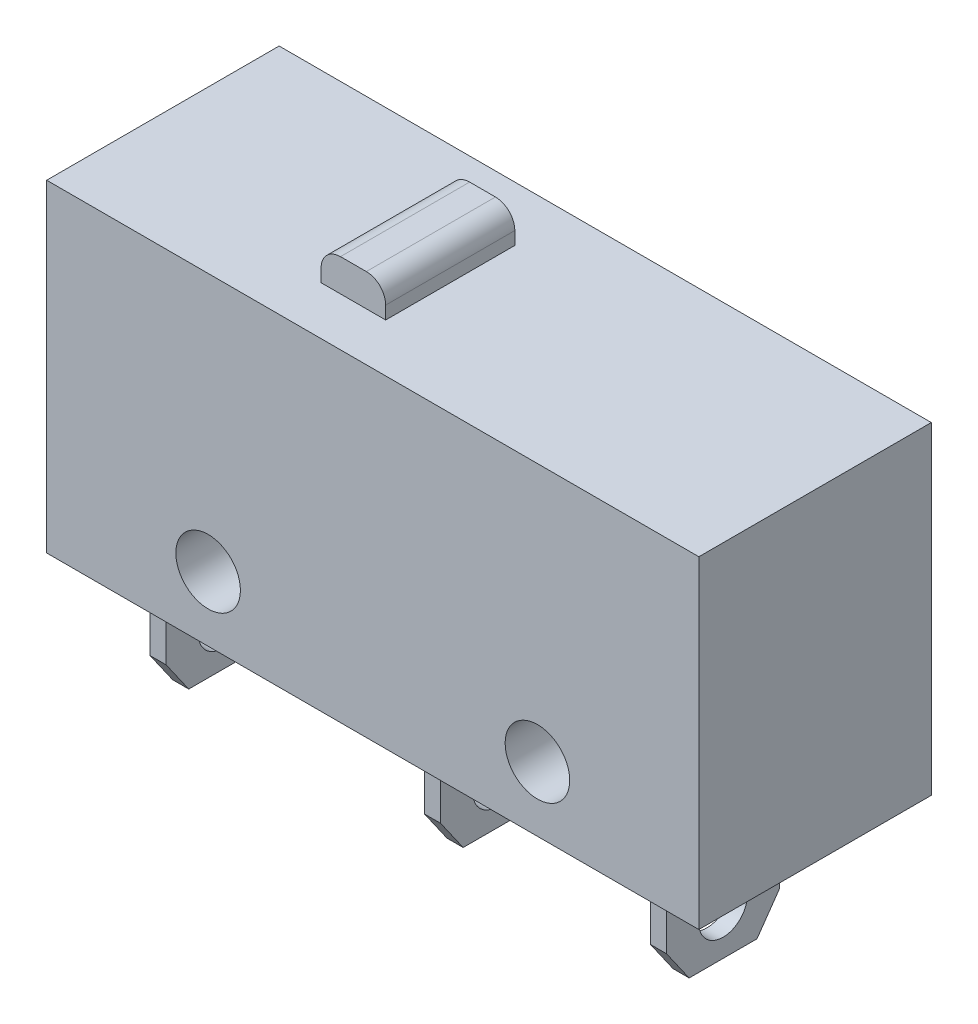
ISO-10303-21;
HEADER;
FILE_DESCRIPTION(('STEP AP214'),'2;1');
FILE_NAME('part.step','',(''),(''),'','','');
FILE_SCHEMA(('AUTOMOTIVE_DESIGN { 1 0 10303 214 1 1 1 1 }'));
ENDSEC;
DATA;
#1=APPLICATION_CONTEXT('core data for automotive mechanical design processes');
#2=APPLICATION_PROTOCOL_DEFINITION('international standard','automotive_design',2000,#1);
#3=PRODUCT_CONTEXT('',#1,'mechanical');
#4=PRODUCT('Part','Part','',(#3));
#5=PRODUCT_RELATED_PRODUCT_CATEGORY('part','',(#4));
#6=PRODUCT_DEFINITION_FORMATION('','',#4);
#7=PRODUCT_DEFINITION_CONTEXT('part definition',#1,'design');
#8=PRODUCT_DEFINITION('design','',#6,#7);
#9=PRODUCT_DEFINITION_SHAPE('','',#8);
#10=(LENGTH_UNIT() NAMED_UNIT(*) SI_UNIT(.MILLI.,.METRE.));
#11=(NAMED_UNIT(*) PLANE_ANGLE_UNIT() SI_UNIT($,.RADIAN.));
#12=(NAMED_UNIT(*) SI_UNIT($,.STERADIAN.) SOLID_ANGLE_UNIT());
#13=UNCERTAINTY_MEASURE_WITH_UNIT(LENGTH_MEASURE(1.E-05),#10,'distance_accuracy_value','');
#14=(GEOMETRIC_REPRESENTATION_CONTEXT(3) GLOBAL_UNCERTAINTY_ASSIGNED_CONTEXT((#13)) GLOBAL_UNIT_ASSIGNED_CONTEXT((#10,
#11,#12)) REPRESENTATION_CONTEXT('',''));
#15=CARTESIAN_POINT('',(0.,0.,0.));
#16=DIRECTION('',(0.,0.,1.));
#17=DIRECTION('',(1.,0.,0.));
#18=AXIS2_PLACEMENT_3D('',#15,#16,#17);
#19=CARTESIAN_POINT('',(0.,10.,0.));
#20=DIRECTION('',(0.,1.,0.));
#21=DIRECTION('',(0.,0.,1.));
#22=AXIS2_PLACEMENT_3D('',#19,#20,#21);
#23=PLANE('',#22);
#24=DIRECTION('',(0.,0.,-1.));
#25=VECTOR('',#24,1.);
#26=CARTESIAN_POINT('',(10.1,10.,-3.6));
#27=LINE('',#26,#25);
#28=CARTESIAN_POINT('',(10.1,10.,3.6));
#29=VERTEX_POINT('',#28);
#30=CARTESIAN_POINT('',(10.1,10.,-3.6));
#31=VERTEX_POINT('',#30);
#32=EDGE_CURVE('E374',#29,#31,#27,.T.);
#33=ORIENTED_EDGE('',*,*,#32,.T.);
#34=DIRECTION('',(-1.,0.,0.));
#35=VECTOR('',#34,1.);
#36=CARTESIAN_POINT('',(-10.1,10.,-3.6));
#37=LINE('',#36,#35);
#38=CARTESIAN_POINT('',(-10.1,10.,-3.6));
#39=VERTEX_POINT('',#38);
#40=EDGE_CURVE('E377',#31,#39,#37,.T.);
#41=ORIENTED_EDGE('',*,*,#40,.T.);
#42=DIRECTION('',(0.,0.,1.));
#43=VECTOR('',#42,1.);
#44=CARTESIAN_POINT('',(-10.1,10.,-3.6));
#45=LINE('',#44,#43);
#46=CARTESIAN_POINT('',(-10.1,10.,3.6));
#47=VERTEX_POINT('',#46);
#48=EDGE_CURVE('E380',#39,#47,#45,.T.);
#49=ORIENTED_EDGE('',*,*,#48,.T.);
#50=DIRECTION('',(1.,0.,0.));
#51=VECTOR('',#50,1.);
#52=CARTESIAN_POINT('',(-10.1,10.,3.6));
#53=LINE('',#52,#51);
#54=EDGE_CURVE('E382',#47,#29,#53,.T.);
#55=ORIENTED_EDGE('',*,*,#54,.T.);
#56=EDGE_LOOP('',(#33,#41,#49,#55));
#57=FACE_BOUND('',#56,.T.);
#58=DIRECTION('',(1.,0.,0.));
#59=VECTOR('',#58,1.);
#60=CARTESIAN_POINT('',(-3.1,10.,2.1));
#61=LINE('',#60,#59);
#62=CARTESIAN_POINT('',(-3.1,10.,2.1));
#63=VERTEX_POINT('',#62);
#64=CARTESIAN_POINT('',(-1.1,10.,2.1));
#65=VERTEX_POINT('',#64);
#66=EDGE_CURVE('E236',#63,#65,#61,.T.);
#67=ORIENTED_EDGE('',*,*,#66,.F.);
#68=DIRECTION('',(0.,0.,1.));
#69=VECTOR('',#68,1.);
#70=CARTESIAN_POINT('',(-3.1,10.,2.1));
#71=LINE('',#70,#69);
#72=CARTESIAN_POINT('',(-3.1,10.,-1.9));
#73=VERTEX_POINT('',#72);
#74=EDGE_CURVE('E244',#73,#63,#71,.T.);
#75=ORIENTED_EDGE('',*,*,#74,.F.);
#76=DIRECTION('',(-1.,0.,0.));
#77=VECTOR('',#76,1.);
#78=CARTESIAN_POINT('',(-3.1,10.,-1.9));
#79=LINE('',#78,#77);
#80=CARTESIAN_POINT('',(-1.1,10.,-1.9));
#81=VERTEX_POINT('',#80);
#82=EDGE_CURVE('E255',#81,#73,#79,.T.);
#83=ORIENTED_EDGE('',*,*,#82,.F.);
#84=DIRECTION('',(0.,0.,-1.));
#85=VECTOR('',#84,1.);
#86=CARTESIAN_POINT('',(-1.1,10.,2.1));
#87=LINE('',#86,#85);
#88=EDGE_CURVE('E253',#65,#81,#87,.T.);
#89=ORIENTED_EDGE('',*,*,#88,.F.);
#90=EDGE_LOOP('',(#67,#75,#83,#89));
#91=FACE_BOUND('',#90,.T.);
#92=ADVANCED_FACE('F49',(#57,#91),#23,.T.);
#93=CARTESIAN_POINT('',(0.,0.,0.));
#94=DIRECTION('',(0.,1.,0.));
#95=DIRECTION('',(0.,0.,1.));
#96=AXIS2_PLACEMENT_3D('',#93,#94,#95);
#97=PLANE('',#96);
#98=DIRECTION('',(1.,0.,0.));
#99=VECTOR('',#98,1.);
#100=CARTESIAN_POINT('',(6.75,0.,-1.75));
#101=LINE('',#100,#99);
#102=CARTESIAN_POINT('',(6.75,0.,-1.75));
#103=VERTEX_POINT('',#102);
#104=CARTESIAN_POINT('',(7.25,0.,-1.75));
#105=VERTEX_POINT('',#104);
#106=EDGE_CURVE('E321',#103,#105,#101,.T.);
#107=ORIENTED_EDGE('',*,*,#106,.F.);
#108=DIRECTION('',(0.,0.,-1.));
#109=VECTOR('',#108,1.);
#110=CARTESIAN_POINT('',(6.75,0.,1.75));
#111=LINE('',#110,#109);
#112=CARTESIAN_POINT('',(6.75,0.,1.75));
#113=VERTEX_POINT('',#112);
#114=EDGE_CURVE('E326',#113,#103,#111,.T.);
#115=ORIENTED_EDGE('',*,*,#114,.F.);
#116=DIRECTION('',(-1.,0.,0.));
#117=VECTOR('',#116,1.);
#118=CARTESIAN_POINT('',(6.75,0.,1.75));
#119=LINE('',#118,#117);
#120=CARTESIAN_POINT('',(7.25,0.,1.75));
#121=VERTEX_POINT('',#120);
#122=EDGE_CURVE('E335',#121,#113,#119,.T.);
#123=ORIENTED_EDGE('',*,*,#122,.F.);
#124=DIRECTION('',(0.,0.,1.));
#125=VECTOR('',#124,1.);
#126=CARTESIAN_POINT('',(7.25,0.,1.75));
#127=LINE('',#126,#125);
#128=EDGE_CURVE('E332',#105,#121,#127,.T.);
#129=ORIENTED_EDGE('',*,*,#128,.F.);
#130=EDGE_LOOP('',(#107,#115,#123,#129));
#131=FACE_BOUND('',#130,.T.);
#132=DIRECTION('',(0.,0.,-1.));
#133=VECTOR('',#132,1.);
#134=CARTESIAN_POINT('',(10.1,0.,-3.6));
#135=LINE('',#134,#133);
#136=CARTESIAN_POINT('',(10.1,0.,3.6));
#137=VERTEX_POINT('',#136);
#138=CARTESIAN_POINT('',(10.1,0.,-3.6));
#139=VERTEX_POINT('',#138);
#140=EDGE_CURVE('E373',#137,#139,#135,.T.);
#141=ORIENTED_EDGE('',*,*,#140,.F.);
#142=DIRECTION('',(1.,0.,0.));
#143=VECTOR('',#142,1.);
#144=CARTESIAN_POINT('',(-10.1,0.,3.6));
#145=LINE('',#144,#143);
#146=CARTESIAN_POINT('',(-10.1,0.,3.6));
#147=VERTEX_POINT('',#146);
#148=EDGE_CURVE('E378',#147,#137,#145,.T.);
#149=ORIENTED_EDGE('',*,*,#148,.F.);
#150=DIRECTION('',(0.,0.,1.));
#151=VECTOR('',#150,1.);
#152=CARTESIAN_POINT('',(-10.1,0.,-3.6));
#153=LINE('',#152,#151);
#154=CARTESIAN_POINT('',(-10.1,0.,-3.6));
#155=VERTEX_POINT('',#154);
#156=EDGE_CURVE('E389',#155,#147,#153,.T.);
#157=ORIENTED_EDGE('',*,*,#156,.F.);
#158=DIRECTION('',(-1.,0.,0.));
#159=VECTOR('',#158,1.);
#160=CARTESIAN_POINT('',(-10.1,0.,-3.6));
#161=LINE('',#160,#159);
#162=EDGE_CURVE('E387',#139,#155,#161,.T.);
#163=ORIENTED_EDGE('',*,*,#162,.F.);
#164=EDGE_LOOP('',(#141,#149,#157,#163));
#165=FACE_BOUND('',#164,.T.);
#166=DIRECTION('',(0.,0.,1.));
#167=VECTOR('',#166,1.);
#168=CARTESIAN_POINT('',(0.25,0.,1.75));
#169=LINE('',#168,#167);
#170=CARTESIAN_POINT('',(0.25,0.,-1.75));
#171=VERTEX_POINT('',#170);
#172=CARTESIAN_POINT('',(0.25,0.,1.75));
#173=VERTEX_POINT('',#172);
#174=EDGE_CURVE('E347',#171,#173,#169,.T.);
#175=ORIENTED_EDGE('',*,*,#174,.F.);
#176=DIRECTION('',(1.,0.,0.));
#177=VECTOR('',#176,1.);
#178=CARTESIAN_POINT('',(-0.25,0.,-1.75));
#179=LINE('',#178,#177);
#180=CARTESIAN_POINT('',(-0.25,0.,-1.75));
#181=VERTEX_POINT('',#180);
#182=EDGE_CURVE('E352',#181,#171,#179,.T.);
#183=ORIENTED_EDGE('',*,*,#182,.F.);
#184=DIRECTION('',(0.,0.,-1.));
#185=VECTOR('',#184,1.);
#186=CARTESIAN_POINT('',(-0.25,0.,1.75));
#187=LINE('',#186,#185);
#188=CARTESIAN_POINT('',(-0.25,0.,1.75));
#189=VERTEX_POINT('',#188);
#190=EDGE_CURVE('E361',#189,#181,#187,.T.);
#191=ORIENTED_EDGE('',*,*,#190,.F.);
#192=DIRECTION('',(-1.,0.,0.));
#193=VECTOR('',#192,1.);
#194=CARTESIAN_POINT('',(-0.25,0.,1.75));
#195=LINE('',#194,#193);
#196=EDGE_CURVE('E358',#173,#189,#195,.T.);
#197=ORIENTED_EDGE('',*,*,#196,.F.);
#198=EDGE_LOOP('',(#175,#183,#191,#197));
#199=FACE_BOUND('',#198,.T.);
#200=DIRECTION('',(1.,0.,0.));
#201=VECTOR('',#200,1.);
#202=CARTESIAN_POINT('',(-8.75,0.,-1.75));
#203=LINE('',#202,#201);
#204=CARTESIAN_POINT('',(-8.75,0.,-1.75));
#205=VERTEX_POINT('',#204);
#206=CARTESIAN_POINT('',(-8.25,0.,-1.75));
#207=VERTEX_POINT('',#206);
#208=EDGE_CURVE('E295',#205,#207,#203,.T.);
#209=ORIENTED_EDGE('',*,*,#208,.F.);
#210=DIRECTION('',(0.,0.,-1.));
#211=VECTOR('',#210,1.);
#212=CARTESIAN_POINT('',(-8.75,0.,1.75));
#213=LINE('',#212,#211);
#214=CARTESIAN_POINT('',(-8.75,0.,1.75));
#215=VERTEX_POINT('',#214);
#216=EDGE_CURVE('E300',#215,#205,#213,.T.);
#217=ORIENTED_EDGE('',*,*,#216,.F.);
#218=DIRECTION('',(-1.,0.,0.));
#219=VECTOR('',#218,1.);
#220=CARTESIAN_POINT('',(-8.75,0.,1.75));
#221=LINE('',#220,#219);
#222=CARTESIAN_POINT('',(-8.25,0.,1.75));
#223=VERTEX_POINT('',#222);
#224=EDGE_CURVE('E309',#223,#215,#221,.T.);
#225=ORIENTED_EDGE('',*,*,#224,.F.);
#226=DIRECTION('',(0.,0.,1.));
#227=VECTOR('',#226,1.);
#228=CARTESIAN_POINT('',(-8.25,0.,1.75));
#229=LINE('',#228,#227);
#230=EDGE_CURVE('E306',#207,#223,#229,.T.);
#231=ORIENTED_EDGE('',*,*,#230,.F.);
#232=EDGE_LOOP('',(#209,#217,#225,#231));
#233=FACE_BOUND('',#232,.T.);
#234=ADVANCED_FACE('F489',(#131,#165,#199,#233),#97,.F.);
#235=CARTESIAN_POINT('',(10.1,10.,-3.6));
#236=DIRECTION('',(-1.,0.,0.));
#237=DIRECTION('',(0.,0.,1.));
#238=AXIS2_PLACEMENT_3D('',#235,#236,#237);
#239=PLANE('',#238);
#240=ORIENTED_EDGE('',*,*,#140,.T.);
#241=DIRECTION('',(0.,-1.,0.));
#242=VECTOR('',#241,1.);
#243=CARTESIAN_POINT('',(10.1,10.,-3.6));
#244=LINE('',#243,#242);
#245=EDGE_CURVE('E400',#31,#139,#244,.T.);
#246=ORIENTED_EDGE('',*,*,#245,.F.);
#247=ORIENTED_EDGE('',*,*,#32,.F.);
#248=DIRECTION('',(0.,-1.,0.));
#249=VECTOR('',#248,1.);
#250=CARTESIAN_POINT('',(10.1,10.,3.6));
#251=LINE('',#250,#249);
#252=EDGE_CURVE('E384',#29,#137,#251,.T.);
#253=ORIENTED_EDGE('',*,*,#252,.T.);
#254=EDGE_LOOP('',(#240,#246,#247,#253));
#255=FACE_BOUND('',#254,.T.);
#256=ADVANCED_FACE('F495',(#255),#239,.F.);
#257=CARTESIAN_POINT('',(-10.1,10.,-3.6));
#258=DIRECTION('',(0.,0.,1.));
#259=DIRECTION('',(1.,0.,0.));
#260=AXIS2_PLACEMENT_3D('',#257,#258,#259);
#261=PLANE('',#260);
#262=CARTESIAN_POINT('',(-5.1,2.,-3.6));
#263=DIRECTION('',(0.,0.,-1.));
#264=DIRECTION('',(1.,0.,0.));
#265=AXIS2_PLACEMENT_3D('',#262,#263,#264);
#266=CIRCLE('',#265,1.);
#267=CARTESIAN_POINT('',(-4.1,2.,-3.6));
#268=VERTEX_POINT('',#267);
#269=EDGE_CURVE('E240',#268,#268,#266,.T.);
#270=ORIENTED_EDGE('',*,*,#269,.F.);
#271=EDGE_LOOP('',(#270));
#272=FACE_BOUND('',#271,.T.);
#273=CARTESIAN_POINT('',(5.1,2.,-3.6));
#274=DIRECTION('',(0.,0.,-1.));
#275=DIRECTION('',(-1.,0.,0.));
#276=AXIS2_PLACEMENT_3D('',#273,#274,#275);
#277=CIRCLE('',#276,1.);
#278=CARTESIAN_POINT('',(4.1,2.,-3.6));
#279=VERTEX_POINT('',#278);
#280=EDGE_CURVE('E269',#279,#279,#277,.T.);
#281=ORIENTED_EDGE('',*,*,#280,.F.);
#282=EDGE_LOOP('',(#281));
#283=FACE_BOUND('',#282,.T.);
#284=ORIENTED_EDGE('',*,*,#162,.T.);
#285=DIRECTION('',(0.,-1.,0.));
#286=VECTOR('',#285,1.);
#287=CARTESIAN_POINT('',(-10.1,10.,-3.6));
#288=LINE('',#287,#286);
#289=EDGE_CURVE('E397',#39,#155,#288,.T.);
#290=ORIENTED_EDGE('',*,*,#289,.F.);
#291=ORIENTED_EDGE('',*,*,#40,.F.);
#292=ORIENTED_EDGE('',*,*,#245,.T.);
#293=EDGE_LOOP('',(#284,#290,#291,#292));
#294=FACE_BOUND('',#293,.T.);
#295=ADVANCED_FACE('F509',(#272,#283,#294),#261,.F.);
#296=CARTESIAN_POINT('',(-10.1,10.,-3.6));
#297=DIRECTION('',(1.,0.,0.));
#298=DIRECTION('',(0.,0.,-1.));
#299=AXIS2_PLACEMENT_3D('',#296,#297,#298);
#300=PLANE('',#299);
#301=ORIENTED_EDGE('',*,*,#156,.T.);
#302=DIRECTION('',(0.,-1.,0.));
#303=VECTOR('',#302,1.);
#304=CARTESIAN_POINT('',(-10.1,10.,3.6));
#305=LINE('',#304,#303);
#306=EDGE_CURVE('E394',#47,#147,#305,.T.);
#307=ORIENTED_EDGE('',*,*,#306,.F.);
#308=ORIENTED_EDGE('',*,*,#48,.F.);
#309=ORIENTED_EDGE('',*,*,#289,.T.);
#310=EDGE_LOOP('',(#301,#307,#308,#309));
#311=FACE_BOUND('',#310,.T.);
#312=ADVANCED_FACE('F505',(#311),#300,.F.);
#313=CARTESIAN_POINT('',(-10.1,10.,3.6));
#314=DIRECTION('',(0.,0.,-1.));
#315=DIRECTION('',(-1.,0.,0.));
#316=AXIS2_PLACEMENT_3D('',#313,#314,#315);
#317=PLANE('',#316);
#318=CARTESIAN_POINT('',(-5.1,2.,3.6));
#319=DIRECTION('',(0.,0.,-1.));
#320=DIRECTION('',(1.,0.,0.));
#321=AXIS2_PLACEMENT_3D('',#318,#319,#320);
#322=CIRCLE('',#321,1.);
#323=CARTESIAN_POINT('',(-4.1,2.,3.6));
#324=VERTEX_POINT('',#323);
#325=EDGE_CURVE('E266',#324,#324,#322,.T.);
#326=ORIENTED_EDGE('',*,*,#325,.T.);
#327=EDGE_LOOP('',(#326));
#328=FACE_BOUND('',#327,.T.);
#329=CARTESIAN_POINT('',(5.1,2.,3.6));
#330=DIRECTION('',(0.,0.,-1.));
#331=DIRECTION('',(-1.,0.,0.));
#332=AXIS2_PLACEMENT_3D('',#329,#330,#331);
#333=CIRCLE('',#332,1.);
#334=CARTESIAN_POINT('',(4.1,2.,3.6));
#335=VERTEX_POINT('',#334);
#336=EDGE_CURVE('E272',#335,#335,#333,.T.);
#337=ORIENTED_EDGE('',*,*,#336,.T.);
#338=EDGE_LOOP('',(#337));
#339=FACE_BOUND('',#338,.T.);
#340=ORIENTED_EDGE('',*,*,#148,.T.);
#341=ORIENTED_EDGE('',*,*,#252,.F.);
#342=ORIENTED_EDGE('',*,*,#54,.F.);
#343=ORIENTED_EDGE('',*,*,#306,.T.);
#344=EDGE_LOOP('',(#340,#341,#342,#343));
#345=FACE_BOUND('',#344,.T.);
#346=ADVANCED_FACE('F502',(#328,#339,#345),#317,.F.);
#347=CARTESIAN_POINT('',(0.25,-4.,1.75));
#348=DIRECTION('',(-1.,0.,0.));
#349=DIRECTION('',(0.,0.,1.));
#350=AXIS2_PLACEMENT_3D('',#347,#348,#349);
#351=PLANE('',#350);
#352=CARTESIAN_POINT('',(0.25,-2.68085686499114,0.));
#353=DIRECTION('',(-1.,0.,0.));
#354=DIRECTION('',(0.,0.,1.));
#355=AXIS2_PLACEMENT_3D('',#352,#353,#354);
#356=CIRCLE('',#355,0.75);
#357=CARTESIAN_POINT('',(0.25,-2.68085686499114,0.75));
#358=VERTEX_POINT('',#357);
#359=EDGE_CURVE('E292',#358,#358,#356,.T.);
#360=ORIENTED_EDGE('',*,*,#359,.T.);
#361=EDGE_LOOP('',(#360));
#362=FACE_BOUND('',#361,.T.);
#363=DIRECTION('',(0.,1.,0.));
#364=VECTOR('',#363,1.);
#365=CARTESIAN_POINT('',(0.25,-4.,1.75));
#366=LINE('',#365,#364);
#367=CARTESIAN_POINT('',(0.25,-3.,1.75));
#368=VERTEX_POINT('',#367);
#369=EDGE_CURVE('E371',#368,#173,#366,.T.);
#370=ORIENTED_EDGE('',*,*,#369,.F.);
#371=DIRECTION('',(0.,-0.819152044288993,-0.573576436351045));
#372=VECTOR('',#371,1.);
#373=CARTESIAN_POINT('',(0.25,-4.,1.04979246179029));
#374=LINE('',#373,#372);
#375=CARTESIAN_POINT('',(0.25,-4.,1.04979246179029));
#376=VERTEX_POINT('',#375);
#377=EDGE_CURVE('E435',#368,#376,#374,.T.);
#378=ORIENTED_EDGE('',*,*,#377,.T.);
#379=DIRECTION('',(0.,0.,1.));
#380=VECTOR('',#379,1.);
#381=CARTESIAN_POINT('',(0.25,-4.,1.75));
#382=LINE('',#381,#380);
#383=CARTESIAN_POINT('',(0.25,-4.,-1.04979246179029));
#384=VERTEX_POINT('',#383);
#385=EDGE_CURVE('E348',#384,#376,#382,.T.);
#386=ORIENTED_EDGE('',*,*,#385,.F.);
#387=DIRECTION('',(0.,0.819152044288993,-0.573576436351045));
#388=VECTOR('',#387,1.);
#389=CARTESIAN_POINT('',(0.25,-4.,-1.04979246179029));
#390=LINE('',#389,#388);
#391=CARTESIAN_POINT('',(0.25,-3.,-1.75));
#392=VERTEX_POINT('',#391);
#393=EDGE_CURVE('E433',#384,#392,#390,.T.);
#394=ORIENTED_EDGE('',*,*,#393,.T.);
#395=DIRECTION('',(0.,1.,0.));
#396=VECTOR('',#395,1.);
#397=CARTESIAN_POINT('',(0.25,-4.,-1.75));
#398=LINE('',#397,#396);
#399=EDGE_CURVE('E355',#392,#171,#398,.T.);
#400=ORIENTED_EDGE('',*,*,#399,.T.);
#401=ORIENTED_EDGE('',*,*,#174,.T.);
#402=EDGE_LOOP('',(#370,#378,#386,#394,#400,#401));
#403=FACE_BOUND('',#402,.T.);
#404=ADVANCED_FACE('F499',(#362,#403),#351,.F.);
#405=CARTESIAN_POINT('',(-0.25,-4.,1.75));
#406=DIRECTION('',(0.,0.,-1.));
#407=DIRECTION('',(-1.,0.,0.));
#408=AXIS2_PLACEMENT_3D('',#405,#406,#407);
#409=PLANE('',#408);
#410=DIRECTION('',(0.,1.,0.));
#411=VECTOR('',#410,1.);
#412=CARTESIAN_POINT('',(-0.25,-4.,1.75));
#413=LINE('',#412,#411);
#414=CARTESIAN_POINT('',(-0.25,-3.,1.75));
#415=VERTEX_POINT('',#414);
#416=EDGE_CURVE('E369',#415,#189,#413,.T.);
#417=ORIENTED_EDGE('',*,*,#416,.F.);
#418=DIRECTION('',(1.,0.,0.));
#419=VECTOR('',#418,1.);
#420=CARTESIAN_POINT('',(0.25,-3.,1.75));
#421=LINE('',#420,#419);
#422=EDGE_CURVE('E431',#415,#368,#421,.T.);
#423=ORIENTED_EDGE('',*,*,#422,.T.);
#424=ORIENTED_EDGE('',*,*,#369,.T.);
#425=ORIENTED_EDGE('',*,*,#196,.T.);
#426=EDGE_LOOP('',(#417,#423,#424,#425));
#427=FACE_BOUND('',#426,.T.);
#428=ADVANCED_FACE('F619',(#427),#409,.F.);
#429=CARTESIAN_POINT('',(-0.25,-4.,1.75));
#430=DIRECTION('',(1.,0.,0.));
#431=DIRECTION('',(0.,0.,-1.));
#432=AXIS2_PLACEMENT_3D('',#429,#430,#431);
#433=PLANE('',#432);
#434=CARTESIAN_POINT('',(-0.25,-2.68085686499114,0.));
#435=DIRECTION('',(1.,0.,0.));
#436=DIRECTION('',(0.,0.,-1.));
#437=AXIS2_PLACEMENT_3D('',#434,#435,#436);
#438=CIRCLE('',#437,0.75);
#439=CARTESIAN_POINT('',(-0.25,-2.68085686499114,-0.75));
#440=VERTEX_POINT('',#439);
#441=EDGE_CURVE('E289',#440,#440,#438,.T.);
#442=ORIENTED_EDGE('',*,*,#441,.T.);
#443=EDGE_LOOP('',(#442));
#444=FACE_BOUND('',#443,.T.);
#445=DIRECTION('',(0.,0.,-1.));
#446=VECTOR('',#445,1.);
#447=CARTESIAN_POINT('',(-0.25,-4.,1.75));
#448=LINE('',#447,#446);
#449=CARTESIAN_POINT('',(-0.25,-4.,1.04979246179029));
#450=VERTEX_POINT('',#449);
#451=CARTESIAN_POINT('',(-0.25,-4.,-1.04979246179029));
#452=VERTEX_POINT('',#451);
#453=EDGE_CURVE('E351',#450,#452,#448,.T.);
#454=ORIENTED_EDGE('',*,*,#453,.F.);
#455=DIRECTION('',(0.,0.819152044288993,0.573576436351045));
#456=VECTOR('',#455,1.);
#457=CARTESIAN_POINT('',(-0.25,-4.,1.04979246179029));
#458=LINE('',#457,#456);
#459=EDGE_CURVE('E429',#450,#415,#458,.T.);
#460=ORIENTED_EDGE('',*,*,#459,.T.);
#461=ORIENTED_EDGE('',*,*,#416,.T.);
#462=ORIENTED_EDGE('',*,*,#190,.T.);
#463=DIRECTION('',(0.,1.,0.));
#464=VECTOR('',#463,1.);
#465=CARTESIAN_POINT('',(-0.25,-4.,-1.75));
#466=LINE('',#465,#464);
#467=CARTESIAN_POINT('',(-0.25,-3.,-1.75));
#468=VERTEX_POINT('',#467);
#469=EDGE_CURVE('E367',#468,#181,#466,.T.);
#470=ORIENTED_EDGE('',*,*,#469,.F.);
#471=DIRECTION('',(0.,-0.819152044288993,0.573576436351045));
#472=VECTOR('',#471,1.);
#473=CARTESIAN_POINT('',(-0.25,-4.,-1.04979246179029));
#474=LINE('',#473,#472);
#475=EDGE_CURVE('E427',#468,#452,#474,.T.);
#476=ORIENTED_EDGE('',*,*,#475,.T.);
#477=EDGE_LOOP('',(#454,#460,#461,#462,#470,#476));
#478=FACE_BOUND('',#477,.T.);
#479=ADVANCED_FACE('F616',(#444,#478),#433,.F.);
#480=CARTESIAN_POINT('',(-0.25,-4.,-1.75));
#481=DIRECTION('',(0.,0.,1.));
#482=DIRECTION('',(1.,0.,0.));
#483=AXIS2_PLACEMENT_3D('',#480,#481,#482);
#484=PLANE('',#483);
#485=ORIENTED_EDGE('',*,*,#399,.F.);
#486=DIRECTION('',(-1.,0.,0.));
#487=VECTOR('',#486,1.);
#488=CARTESIAN_POINT('',(-0.25,-3.,-1.75));
#489=LINE('',#488,#487);
#490=EDGE_CURVE('E437',#392,#468,#489,.T.);
#491=ORIENTED_EDGE('',*,*,#490,.T.);
#492=ORIENTED_EDGE('',*,*,#469,.T.);
#493=ORIENTED_EDGE('',*,*,#182,.T.);
#494=EDGE_LOOP('',(#485,#491,#492,#493));
#495=FACE_BOUND('',#494,.T.);
#496=ADVANCED_FACE('F612',(#495),#484,.F.);
#497=CARTESIAN_POINT('',(0.,-4.,0.));
#498=DIRECTION('',(0.,-1.,0.));
#499=DIRECTION('',(0.,0.,-1.));
#500=AXIS2_PLACEMENT_3D('',#497,#498,#499);
#501=PLANE('',#500);
#502=ORIENTED_EDGE('',*,*,#385,.T.);
#503=DIRECTION('',(-1.,0.,0.));
#504=VECTOR('',#503,1.);
#505=CARTESIAN_POINT('',(-0.25,-4.,1.04979246179029));
#506=LINE('',#505,#504);
#507=EDGE_CURVE('E424',#376,#450,#506,.T.);
#508=ORIENTED_EDGE('',*,*,#507,.T.);
#509=ORIENTED_EDGE('',*,*,#453,.T.);
#510=DIRECTION('',(1.,0.,0.));
#511=VECTOR('',#510,1.);
#512=CARTESIAN_POINT('',(0.25,-4.,-1.04979246179029));
#513=LINE('',#512,#511);
#514=EDGE_CURVE('E421',#452,#384,#513,.T.);
#515=ORIENTED_EDGE('',*,*,#514,.T.);
#516=EDGE_LOOP('',(#502,#508,#509,#515));
#517=FACE_BOUND('',#516,.T.);
#518=ADVANCED_FACE('F608',(#517),#501,.T.);
#519=CARTESIAN_POINT('',(6.75,-4.,-1.75));
#520=DIRECTION('',(0.,0.,1.));
#521=DIRECTION('',(1.,0.,0.));
#522=AXIS2_PLACEMENT_3D('',#519,#520,#521);
#523=PLANE('',#522);
#524=DIRECTION('',(0.,1.,0.));
#525=VECTOR('',#524,1.);
#526=CARTESIAN_POINT('',(7.25,-4.,-1.75));
#527=LINE('',#526,#525);
#528=CARTESIAN_POINT('',(7.25,-3.,-1.75));
#529=VERTEX_POINT('',#528);
#530=EDGE_CURVE('E345',#529,#105,#527,.T.);
#531=ORIENTED_EDGE('',*,*,#530,.F.);
#532=DIRECTION('',(-1.,0.,0.));
#533=VECTOR('',#532,1.);
#534=CARTESIAN_POINT('',(6.75,-3.,-1.75));
#535=LINE('',#534,#533);
#536=CARTESIAN_POINT('',(6.75,-3.,-1.75));
#537=VERTEX_POINT('',#536);
#538=EDGE_CURVE('E413',#529,#537,#535,.T.);
#539=ORIENTED_EDGE('',*,*,#538,.T.);
#540=DIRECTION('',(0.,1.,0.));
#541=VECTOR('',#540,1.);
#542=CARTESIAN_POINT('',(6.75,-4.,-1.75));
#543=LINE('',#542,#541);
#544=EDGE_CURVE('E329',#537,#103,#543,.T.);
#545=ORIENTED_EDGE('',*,*,#544,.T.);
#546=ORIENTED_EDGE('',*,*,#106,.T.);
#547=EDGE_LOOP('',(#531,#539,#545,#546));
#548=FACE_BOUND('',#547,.T.);
#549=ADVANCED_FACE('F604',(#548),#523,.F.);
#550=CARTESIAN_POINT('',(7.25,-4.,1.75));
#551=DIRECTION('',(-1.,0.,0.));
#552=DIRECTION('',(0.,0.,1.));
#553=AXIS2_PLACEMENT_3D('',#550,#551,#552);
#554=PLANE('',#553);
#555=CARTESIAN_POINT('',(7.25,-2.68085686499114,0.));
#556=DIRECTION('',(-1.,0.,0.));
#557=DIRECTION('',(0.,0.,1.));
#558=AXIS2_PLACEMENT_3D('',#555,#556,#557);
#559=CIRCLE('',#558,0.75);
#560=CARTESIAN_POINT('',(7.25,-2.68085686499114,0.75));
#561=VERTEX_POINT('',#560);
#562=EDGE_CURVE('E280',#561,#561,#559,.F.);
#563=ORIENTED_EDGE('',*,*,#562,.F.);
#564=EDGE_LOOP('',(#563));
#565=FACE_BOUND('',#564,.T.);
#566=DIRECTION('',(0.,0.,1.));
#567=VECTOR('',#566,1.);
#568=CARTESIAN_POINT('',(7.25,-4.,1.75));
#569=LINE('',#568,#567);
#570=CARTESIAN_POINT('',(7.25,-4.,-1.04979246179029));
#571=VERTEX_POINT('',#570);
#572=CARTESIAN_POINT('',(7.25,-4.,1.04979246179029));
#573=VERTEX_POINT('',#572);
#574=EDGE_CURVE('E322',#571,#573,#569,.T.);
#575=ORIENTED_EDGE('',*,*,#574,.F.);
#576=DIRECTION('',(0.,-0.819152044288993,0.573576436351045));
#577=VECTOR('',#576,1.);
#578=CARTESIAN_POINT('',(7.25,-4.,-1.04979246179029));
#579=LINE('',#578,#577);
#580=EDGE_CURVE('E411',#571,#529,#579,.F.);
#581=ORIENTED_EDGE('',*,*,#580,.T.);
#582=ORIENTED_EDGE('',*,*,#530,.T.);
#583=ORIENTED_EDGE('',*,*,#128,.T.);
#584=DIRECTION('',(0.,1.,0.));
#585=VECTOR('',#584,1.);
#586=CARTESIAN_POINT('',(7.25,-4.,1.75));
#587=LINE('',#586,#585);
#588=CARTESIAN_POINT('',(7.25,-3.,1.75));
#589=VERTEX_POINT('',#588);
#590=EDGE_CURVE('E343',#589,#121,#587,.T.);
#591=ORIENTED_EDGE('',*,*,#590,.F.);
#592=DIRECTION('',(0.,0.819152044288993,0.573576436351045));
#593=VECTOR('',#592,1.);
#594=CARTESIAN_POINT('',(7.25,-4.,1.04979246179029));
#595=LINE('',#594,#593);
#596=EDGE_CURVE('E409',#589,#573,#595,.F.);
#597=ORIENTED_EDGE('',*,*,#596,.T.);
#598=EDGE_LOOP('',(#575,#581,#582,#583,#591,#597));
#599=FACE_BOUND('',#598,.T.);
#600=ADVANCED_FACE('F600',(#565,#599),#554,.F.);
#601=CARTESIAN_POINT('',(6.75,-4.,1.75));
#602=DIRECTION('',(0.,0.,-1.));
#603=DIRECTION('',(-1.,0.,0.));
#604=AXIS2_PLACEMENT_3D('',#601,#602,#603);
#605=PLANE('',#604);
#606=DIRECTION('',(0.,1.,0.));
#607=VECTOR('',#606,1.);
#608=CARTESIAN_POINT('',(6.75,-4.,1.75));
#609=LINE('',#608,#607);
#610=CARTESIAN_POINT('',(6.75,-3.,1.75));
#611=VERTEX_POINT('',#610);
#612=EDGE_CURVE('E341',#611,#113,#609,.T.);
#613=ORIENTED_EDGE('',*,*,#612,.F.);
#614=DIRECTION('',(1.,0.,0.));
#615=VECTOR('',#614,1.);
#616=CARTESIAN_POINT('',(6.75,-3.,1.75));
#617=LINE('',#616,#615);
#618=EDGE_CURVE('E419',#611,#589,#617,.T.);
#619=ORIENTED_EDGE('',*,*,#618,.T.);
#620=ORIENTED_EDGE('',*,*,#590,.T.);
#621=ORIENTED_EDGE('',*,*,#122,.T.);
#622=EDGE_LOOP('',(#613,#619,#620,#621));
#623=FACE_BOUND('',#622,.T.);
#624=ADVANCED_FACE('F596',(#623),#605,.F.);
#625=CARTESIAN_POINT('',(6.75,-4.,1.75));
#626=DIRECTION('',(1.,0.,0.));
#627=DIRECTION('',(0.,0.,-1.));
#628=AXIS2_PLACEMENT_3D('',#625,#626,#627);
#629=PLANE('',#628);
#630=CARTESIAN_POINT('',(6.75,-2.68085686499114,0.));
#631=DIRECTION('',(1.,0.,0.));
#632=DIRECTION('',(0.,0.,-1.));
#633=AXIS2_PLACEMENT_3D('',#630,#631,#632);
#634=CIRCLE('',#633,0.75);
#635=CARTESIAN_POINT('',(6.75,-2.68085686499114,-0.75));
#636=VERTEX_POINT('',#635);
#637=EDGE_CURVE('E286',#636,#636,#634,.T.);
#638=ORIENTED_EDGE('',*,*,#637,.T.);
#639=EDGE_LOOP('',(#638));
#640=FACE_BOUND('',#639,.T.);
#641=ORIENTED_EDGE('',*,*,#544,.F.);
#642=DIRECTION('',(0.,0.819152044288993,-0.573576436351045));
#643=VECTOR('',#642,1.);
#644=CARTESIAN_POINT('',(6.75,-4.,-1.04979246179029));
#645=LINE('',#644,#643);
#646=CARTESIAN_POINT('',(6.75,-4.,-1.04979246179029));
#647=VERTEX_POINT('',#646);
#648=EDGE_CURVE('E417',#537,#647,#645,.F.);
#649=ORIENTED_EDGE('',*,*,#648,.T.);
#650=DIRECTION('',(0.,0.,-1.));
#651=VECTOR('',#650,1.);
#652=CARTESIAN_POINT('',(6.75,-4.,1.75));
#653=LINE('',#652,#651);
#654=CARTESIAN_POINT('',(6.75,-4.,1.04979246179029));
#655=VERTEX_POINT('',#654);
#656=EDGE_CURVE('E325',#655,#647,#653,.T.);
#657=ORIENTED_EDGE('',*,*,#656,.F.);
#658=DIRECTION('',(0.,-0.819152044288993,-0.573576436351045));
#659=VECTOR('',#658,1.);
#660=CARTESIAN_POINT('',(6.75,-4.,1.04979246179029));
#661=LINE('',#660,#659);
#662=EDGE_CURVE('E415',#655,#611,#661,.F.);
#663=ORIENTED_EDGE('',*,*,#662,.T.);
#664=ORIENTED_EDGE('',*,*,#612,.T.);
#665=ORIENTED_EDGE('',*,*,#114,.T.);
#666=EDGE_LOOP('',(#641,#649,#657,#663,#664,#665));
#667=FACE_BOUND('',#666,.T.);
#668=ADVANCED_FACE('F592',(#640,#667),#629,.F.);
#669=CARTESIAN_POINT('',(0.,-4.,0.));
#670=DIRECTION('',(0.,1.,0.));
#671=DIRECTION('',(0.,0.,1.));
#672=AXIS2_PLACEMENT_3D('',#669,#670,#671);
#673=PLANE('',#672);
#674=ORIENTED_EDGE('',*,*,#656,.T.);
#675=DIRECTION('',(1.,0.,0.));
#676=VECTOR('',#675,1.);
#677=CARTESIAN_POINT('',(0.,-4.,-1.04979246179029));
#678=LINE('',#677,#676);
#679=EDGE_CURVE('E406',#647,#571,#678,.T.);
#680=ORIENTED_EDGE('',*,*,#679,.T.);
#681=ORIENTED_EDGE('',*,*,#574,.T.);
#682=DIRECTION('',(-1.,0.,0.));
#683=VECTOR('',#682,1.);
#684=CARTESIAN_POINT('',(0.,-4.,1.04979246179029));
#685=LINE('',#684,#683);
#686=EDGE_CURVE('E403',#573,#655,#685,.T.);
#687=ORIENTED_EDGE('',*,*,#686,.T.);
#688=EDGE_LOOP('',(#674,#680,#681,#687));
#689=FACE_BOUND('',#688,.T.);
#690=ADVANCED_FACE('F589',(#689),#673,.F.);
#691=CARTESIAN_POINT('',(-8.75,-4.,-1.75));
#692=DIRECTION('',(0.,0.,1.));
#693=DIRECTION('',(1.,0.,0.));
#694=AXIS2_PLACEMENT_3D('',#691,#692,#693);
#695=PLANE('',#694);
#696=DIRECTION('',(0.,1.,0.));
#697=VECTOR('',#696,1.);
#698=CARTESIAN_POINT('',(-8.25,-4.,-1.75));
#699=LINE('',#698,#697);
#700=CARTESIAN_POINT('',(-8.25,-3.,-1.75));
#701=VERTEX_POINT('',#700);
#702=EDGE_CURVE('E319',#701,#207,#699,.T.);
#703=ORIENTED_EDGE('',*,*,#702,.F.);
#704=DIRECTION('',(-1.,0.,0.));
#705=VECTOR('',#704,1.);
#706=CARTESIAN_POINT('',(-8.75,-3.,-1.75));
#707=LINE('',#706,#705);
#708=CARTESIAN_POINT('',(-8.75,-3.,-1.75));
#709=VERTEX_POINT('',#708);
#710=EDGE_CURVE('E449',#701,#709,#707,.T.);
#711=ORIENTED_EDGE('',*,*,#710,.T.);
#712=DIRECTION('',(0.,1.,0.));
#713=VECTOR('',#712,1.);
#714=CARTESIAN_POINT('',(-8.75,-4.,-1.75));
#715=LINE('',#714,#713);
#716=EDGE_CURVE('E303',#709,#205,#715,.T.);
#717=ORIENTED_EDGE('',*,*,#716,.T.);
#718=ORIENTED_EDGE('',*,*,#208,.T.);
#719=EDGE_LOOP('',(#703,#711,#717,#718));
#720=FACE_BOUND('',#719,.T.);
#721=ADVANCED_FACE('F564',(#720),#695,.F.);
#722=CARTESIAN_POINT('',(-8.25,-4.,1.75));
#723=DIRECTION('',(-1.,0.,0.));
#724=DIRECTION('',(0.,0.,1.));
#725=AXIS2_PLACEMENT_3D('',#722,#723,#724);
#726=PLANE('',#725);
#727=CARTESIAN_POINT('',(-8.25,-2.68085686499114,0.));
#728=DIRECTION('',(-1.,0.,0.));
#729=DIRECTION('',(0.,0.,1.));
#730=AXIS2_PLACEMENT_3D('',#727,#728,#729);
#731=CIRCLE('',#730,0.75);
#732=CARTESIAN_POINT('',(-8.25,-2.68085686499114,0.75));
#733=VERTEX_POINT('',#732);
#734=EDGE_CURVE('E283',#733,#733,#731,.T.);
#735=ORIENTED_EDGE('',*,*,#734,.T.);
#736=EDGE_LOOP('',(#735));
#737=FACE_BOUND('',#736,.T.);
#738=DIRECTION('',(0.,0.,1.));
#739=VECTOR('',#738,1.);
#740=CARTESIAN_POINT('',(-8.25,-4.,1.75));
#741=LINE('',#740,#739);
#742=CARTESIAN_POINT('',(-8.25,-4.,-1.04979246179029));
#743=VERTEX_POINT('',#742);
#744=CARTESIAN_POINT('',(-8.25,-4.,1.04979246179029));
#745=VERTEX_POINT('',#744);
#746=EDGE_CURVE('E296',#743,#745,#741,.T.);
#747=ORIENTED_EDGE('',*,*,#746,.F.);
#748=DIRECTION('',(0.,-0.819152044288993,0.573576436351045));
#749=VECTOR('',#748,1.);
#750=CARTESIAN_POINT('',(-8.25,-4.,-1.04979246179029));
#751=LINE('',#750,#749);
#752=EDGE_CURVE('E447',#743,#701,#751,.F.);
#753=ORIENTED_EDGE('',*,*,#752,.T.);
#754=ORIENTED_EDGE('',*,*,#702,.T.);
#755=ORIENTED_EDGE('',*,*,#230,.T.);
#756=DIRECTION('',(0.,1.,0.));
#757=VECTOR('',#756,1.);
#758=CARTESIAN_POINT('',(-8.25,-4.,1.75));
#759=LINE('',#758,#757);
#760=CARTESIAN_POINT('',(-8.25,-3.,1.75));
#761=VERTEX_POINT('',#760);
#762=EDGE_CURVE('E317',#761,#223,#759,.T.);
#763=ORIENTED_EDGE('',*,*,#762,.F.);
#764=DIRECTION('',(0.,0.819152044288993,0.573576436351045));
#765=VECTOR('',#764,1.);
#766=CARTESIAN_POINT('',(-8.25,-4.,1.04979246179029));
#767=LINE('',#766,#765);
#768=EDGE_CURVE('E445',#761,#745,#767,.F.);
#769=ORIENTED_EDGE('',*,*,#768,.T.);
#770=EDGE_LOOP('',(#747,#753,#754,#755,#763,#769));
#771=FACE_BOUND('',#770,.T.);
#772=ADVANCED_FACE('F554',(#737,#771),#726,.F.);
#773=CARTESIAN_POINT('',(-8.75,-4.,1.75));
#774=DIRECTION('',(0.,0.,-1.));
#775=DIRECTION('',(-1.,0.,0.));
#776=AXIS2_PLACEMENT_3D('',#773,#774,#775);
#777=PLANE('',#776);
#778=DIRECTION('',(0.,1.,0.));
#779=VECTOR('',#778,1.);
#780=CARTESIAN_POINT('',(-8.75,-4.,1.75));
#781=LINE('',#780,#779);
#782=CARTESIAN_POINT('',(-8.75,-3.,1.75));
#783=VERTEX_POINT('',#782);
#784=EDGE_CURVE('E315',#783,#215,#781,.T.);
#785=ORIENTED_EDGE('',*,*,#784,.F.);
#786=DIRECTION('',(1.,0.,0.));
#787=VECTOR('',#786,1.);
#788=CARTESIAN_POINT('',(-8.75,-3.,1.75));
#789=LINE('',#788,#787);
#790=EDGE_CURVE('E455',#783,#761,#789,.T.);
#791=ORIENTED_EDGE('',*,*,#790,.T.);
#792=ORIENTED_EDGE('',*,*,#762,.T.);
#793=ORIENTED_EDGE('',*,*,#224,.T.);
#794=EDGE_LOOP('',(#785,#791,#792,#793));
#795=FACE_BOUND('',#794,.T.);
#796=ADVANCED_FACE('F574',(#795),#777,.F.);
#797=CARTESIAN_POINT('',(-8.75,-4.,1.75));
#798=DIRECTION('',(1.,0.,0.));
#799=DIRECTION('',(0.,0.,-1.));
#800=AXIS2_PLACEMENT_3D('',#797,#798,#799);
#801=PLANE('',#800);
#802=CARTESIAN_POINT('',(-8.75,-2.68085686499114,0.));
#803=DIRECTION('',(-1.,0.,0.));
#804=DIRECTION('',(0.,0.,1.));
#805=AXIS2_PLACEMENT_3D('',#802,#803,#804);
#806=CIRCLE('',#805,0.75);
#807=CARTESIAN_POINT('',(-8.75,-2.68085686499114,0.75));
#808=VERTEX_POINT('',#807);
#809=EDGE_CURVE('E275',#808,#808,#806,.T.);
#810=ORIENTED_EDGE('',*,*,#809,.F.);
#811=EDGE_LOOP('',(#810));
#812=FACE_BOUND('',#811,.T.);
#813=ORIENTED_EDGE('',*,*,#716,.F.);
#814=DIRECTION('',(0.,0.819152044288993,-0.573576436351045));
#815=VECTOR('',#814,1.);
#816=CARTESIAN_POINT('',(-8.75,-4.,-1.04979246179029));
#817=LINE('',#816,#815);
#818=CARTESIAN_POINT('',(-8.75,-4.,-1.04979246179029));
#819=VERTEX_POINT('',#818);
#820=EDGE_CURVE('E453',#709,#819,#817,.F.);
#821=ORIENTED_EDGE('',*,*,#820,.T.);
#822=DIRECTION('',(0.,0.,-1.));
#823=VECTOR('',#822,1.);
#824=CARTESIAN_POINT('',(-8.75,-4.,1.75));
#825=LINE('',#824,#823);
#826=CARTESIAN_POINT('',(-8.75,-4.,1.04979246179029));
#827=VERTEX_POINT('',#826);
#828=EDGE_CURVE('E299',#827,#819,#825,.T.);
#829=ORIENTED_EDGE('',*,*,#828,.F.);
#830=DIRECTION('',(0.,-0.819152044288993,-0.573576436351045));
#831=VECTOR('',#830,1.);
#832=CARTESIAN_POINT('',(-8.75,-4.,1.04979246179029));
#833=LINE('',#832,#831);
#834=EDGE_CURVE('E451',#827,#783,#833,.F.);
#835=ORIENTED_EDGE('',*,*,#834,.T.);
#836=ORIENTED_EDGE('',*,*,#784,.T.);
#837=ORIENTED_EDGE('',*,*,#216,.T.);
#838=EDGE_LOOP('',(#813,#821,#829,#835,#836,#837));
#839=FACE_BOUND('',#838,.T.);
#840=ADVANCED_FACE('F571',(#812,#839),#801,.F.);
#841=CARTESIAN_POINT('',(0.,-4.,0.));
#842=DIRECTION('',(0.,1.,0.));
#843=DIRECTION('',(0.,0.,1.));
#844=AXIS2_PLACEMENT_3D('',#841,#842,#843);
#845=PLANE('',#844);
#846=ORIENTED_EDGE('',*,*,#828,.T.);
#847=DIRECTION('',(1.,0.,0.));
#848=VECTOR('',#847,1.);
#849=CARTESIAN_POINT('',(0.,-4.,-1.04979246179029));
#850=LINE('',#849,#848);
#851=EDGE_CURVE('E442',#819,#743,#850,.T.);
#852=ORIENTED_EDGE('',*,*,#851,.T.);
#853=ORIENTED_EDGE('',*,*,#746,.T.);
#854=DIRECTION('',(-1.,0.,0.));
#855=VECTOR('',#854,1.);
#856=CARTESIAN_POINT('',(0.,-4.,1.04979246179029));
#857=LINE('',#856,#855);
#858=EDGE_CURVE('E439',#745,#827,#857,.T.);
#859=ORIENTED_EDGE('',*,*,#858,.T.);
#860=EDGE_LOOP('',(#846,#852,#853,#859));
#861=FACE_BOUND('',#860,.T.);
#862=ADVANCED_FACE('F556',(#861),#845,.F.);
#863=CARTESIAN_POINT('',(9.37132034355964,-2.68085686499114,0.));
#864=DIRECTION('',(-1.,0.,0.));
#865=DIRECTION('',(0.,0.,1.));
#866=AXIS2_PLACEMENT_3D('',#863,#864,#865);
#867=CYLINDRICAL_SURFACE('',#866,0.75);
#868=ORIENTED_EDGE('',*,*,#809,.T.);
#869=EDGE_LOOP('',(#868));
#870=FACE_BOUND('',#869,.T.);
#871=ORIENTED_EDGE('',*,*,#734,.F.);
#872=EDGE_LOOP('',(#871));
#873=FACE_BOUND('',#872,.T.);
#874=ADVANCED_FACE('F654',(#870,#873),#867,.F.);
#875=ORIENTED_EDGE('',*,*,#562,.T.);
#876=EDGE_LOOP('',(#875));
#877=FACE_BOUND('',#876,.T.);
#878=ORIENTED_EDGE('',*,*,#637,.F.);
#879=EDGE_LOOP('',(#878));
#880=FACE_BOUND('',#879,.T.);
#881=ADVANCED_FACE('F651',(#877,#880),#867,.F.);
#882=ORIENTED_EDGE('',*,*,#441,.F.);
#883=EDGE_LOOP('',(#882));
#884=FACE_BOUND('',#883,.T.);
#885=ORIENTED_EDGE('',*,*,#359,.F.);
#886=EDGE_LOOP('',(#885));
#887=FACE_BOUND('',#886,.T.);
#888=ADVANCED_FACE('F521',(#884,#887),#867,.F.);
#889=CARTESIAN_POINT('',(0.,-4.,-1.04979246179029));
#890=DIRECTION('',(0.,0.573576436351045,0.819152044288993));
#891=DIRECTION('',(1.,0.,0.));
#892=AXIS2_PLACEMENT_3D('',#889,#890,#891);
#893=PLANE('',#892);
#894=ORIENTED_EDGE('',*,*,#648,.F.);
#895=ORIENTED_EDGE('',*,*,#538,.F.);
#896=ORIENTED_EDGE('',*,*,#580,.F.);
#897=ORIENTED_EDGE('',*,*,#679,.F.);
#898=EDGE_LOOP('',(#894,#895,#896,#897));
#899=FACE_BOUND('',#898,.T.);
#900=ADVANCED_FACE('F517',(#899),#893,.F.);
#901=CARTESIAN_POINT('',(0.,-4.,1.04979246179029));
#902=DIRECTION('',(0.,0.573576436351045,-0.819152044288993));
#903=DIRECTION('',(-1.,0.,0.));
#904=AXIS2_PLACEMENT_3D('',#901,#902,#903);
#905=PLANE('',#904);
#906=ORIENTED_EDGE('',*,*,#596,.F.);
#907=ORIENTED_EDGE('',*,*,#618,.F.);
#908=ORIENTED_EDGE('',*,*,#662,.F.);
#909=ORIENTED_EDGE('',*,*,#686,.F.);
#910=EDGE_LOOP('',(#906,#907,#908,#909));
#911=FACE_BOUND('',#910,.T.);
#912=ADVANCED_FACE('F520',(#911),#905,.F.);
#913=CARTESIAN_POINT('',(0.,-4.,1.04979246179029));
#914=DIRECTION('',(0.,-0.573576436351045,0.819152044288993));
#915=DIRECTION('',(1.,0.,0.));
#916=AXIS2_PLACEMENT_3D('',#913,#914,#915);
#917=PLANE('',#916);
#918=ORIENTED_EDGE('',*,*,#377,.F.);
#919=ORIENTED_EDGE('',*,*,#422,.F.);
#920=ORIENTED_EDGE('',*,*,#459,.F.);
#921=ORIENTED_EDGE('',*,*,#507,.F.);
#922=EDGE_LOOP('',(#918,#919,#920,#921));
#923=FACE_BOUND('',#922,.T.);
#924=ADVANCED_FACE('F525',(#923),#917,.T.);
#925=CARTESIAN_POINT('',(0.,-4.,-1.04979246179029));
#926=DIRECTION('',(0.,-0.573576436351045,-0.819152044288993));
#927=DIRECTION('',(-1.,0.,0.));
#928=AXIS2_PLACEMENT_3D('',#925,#926,#927);
#929=PLANE('',#928);
#930=ORIENTED_EDGE('',*,*,#475,.F.);
#931=ORIENTED_EDGE('',*,*,#490,.F.);
#932=ORIENTED_EDGE('',*,*,#393,.F.);
#933=ORIENTED_EDGE('',*,*,#514,.F.);
#934=EDGE_LOOP('',(#930,#931,#932,#933));
#935=FACE_BOUND('',#934,.T.);
#936=ADVANCED_FACE('F529',(#935),#929,.T.);
#937=CARTESIAN_POINT('',(0.,-4.,-1.04979246179029));
#938=DIRECTION('',(0.,0.573576436351045,0.819152044288993));
#939=DIRECTION('',(1.,0.,0.));
#940=AXIS2_PLACEMENT_3D('',#937,#938,#939);
#941=PLANE('',#940);
#942=ORIENTED_EDGE('',*,*,#820,.F.);
#943=ORIENTED_EDGE('',*,*,#710,.F.);
#944=ORIENTED_EDGE('',*,*,#752,.F.);
#945=ORIENTED_EDGE('',*,*,#851,.F.);
#946=EDGE_LOOP('',(#942,#943,#944,#945));
#947=FACE_BOUND('',#946,.T.);
#948=ADVANCED_FACE('F533',(#947),#941,.F.);
#949=CARTESIAN_POINT('',(0.,-4.,1.04979246179029));
#950=DIRECTION('',(0.,0.573576436351045,-0.819152044288993));
#951=DIRECTION('',(-1.,0.,0.));
#952=AXIS2_PLACEMENT_3D('',#949,#950,#951);
#953=PLANE('',#952);
#954=ORIENTED_EDGE('',*,*,#768,.F.);
#955=ORIENTED_EDGE('',*,*,#790,.F.);
#956=ORIENTED_EDGE('',*,*,#834,.F.);
#957=ORIENTED_EDGE('',*,*,#858,.F.);
#958=EDGE_LOOP('',(#954,#955,#956,#957));
#959=FACE_BOUND('',#958,.T.);
#960=ADVANCED_FACE('F537',(#959),#953,.F.);
#961=CARTESIAN_POINT('',(5.1,2.,3.6));
#962=DIRECTION('',(0.,0.,-1.));
#963=DIRECTION('',(-1.,0.,0.));
#964=AXIS2_PLACEMENT_3D('',#961,#962,#963);
#965=CYLINDRICAL_SURFACE('',#964,1.);
#966=ORIENTED_EDGE('',*,*,#336,.F.);
#967=EDGE_LOOP('',(#966));
#968=FACE_BOUND('',#967,.T.);
#969=ORIENTED_EDGE('',*,*,#280,.T.);
#970=EDGE_LOOP('',(#969));
#971=FACE_BOUND('',#970,.T.);
#972=ADVANCED_FACE('F540',(#968,#971),#965,.F.);
#973=CARTESIAN_POINT('',(-5.1,2.,3.6));
#974=DIRECTION('',(0.,0.,-1.));
#975=DIRECTION('',(-1.,0.,0.));
#976=AXIS2_PLACEMENT_3D('',#973,#974,#975);
#977=CYLINDRICAL_SURFACE('',#976,1.);
#978=ORIENTED_EDGE('',*,*,#325,.F.);
#979=EDGE_LOOP('',(#978));
#980=FACE_BOUND('',#979,.T.);
#981=ORIENTED_EDGE('',*,*,#269,.T.);
#982=EDGE_LOOP('',(#981));
#983=FACE_BOUND('',#982,.T.);
#984=ADVANCED_FACE('F545',(#980,#983),#977,.F.);
#985=CARTESIAN_POINT('',(-3.1,11.,2.1));
#986=DIRECTION('',(1.,0.,0.));
#987=DIRECTION('',(0.,0.,-1.));
#988=AXIS2_PLACEMENT_3D('',#985,#986,#987);
#989=PLANE('',#988);
#990=DIRECTION('',(0.,-1.,0.));
#991=VECTOR('',#990,1.);
#992=CARTESIAN_POINT('',(-3.1,11.,2.1));
#993=LINE('',#992,#991);
#994=CARTESIAN_POINT('',(-3.1,10.4,2.1));
#995=VERTEX_POINT('',#994);
#996=EDGE_CURVE('E232',#995,#63,#993,.T.);
#997=ORIENTED_EDGE('',*,*,#996,.F.);
#998=DIRECTION('',(0.,0.,1.));
#999=VECTOR('',#998,1.);
#1000=CARTESIAN_POINT('',(-3.1,10.4,2.1));
#1001=LINE('',#1000,#999);
#1002=CARTESIAN_POINT('',(-3.1,10.4,-1.9));
#1003=VERTEX_POINT('',#1002);
#1004=EDGE_CURVE('E13',#995,#1003,#1001,.F.);
#1005=ORIENTED_EDGE('',*,*,#1004,.T.);
#1006=DIRECTION('',(0.,-1.,0.));
#1007=VECTOR('',#1006,1.);
#1008=CARTESIAN_POINT('',(-3.1,11.,-1.9));
#1009=LINE('',#1008,#1007);
#1010=EDGE_CURVE('E247',#1003,#73,#1009,.T.);
#1011=ORIENTED_EDGE('',*,*,#1010,.T.);
#1012=ORIENTED_EDGE('',*,*,#74,.T.);
#1013=EDGE_LOOP('',(#997,#1005,#1011,#1012));
#1014=FACE_BOUND('',#1013,.T.);
#1015=ADVANCED_FACE('F245',(#1014),#989,.F.);
#1016=CARTESIAN_POINT('',(-3.1,11.,2.1));
#1017=DIRECTION('',(0.,0.,-1.));
#1018=DIRECTION('',(-1.,0.,0.));
#1019=AXIS2_PLACEMENT_3D('',#1016,#1017,#1018);
#1020=PLANE('',#1019);
#1021=DIRECTION('',(0.,-1.,0.));
#1022=VECTOR('',#1021,1.);
#1023=CARTESIAN_POINT('',(-1.1,11.,2.1));
#1024=LINE('',#1023,#1022);
#1025=CARTESIAN_POINT('',(-1.1,10.4,2.1));
#1026=VERTEX_POINT('',#1025);
#1027=EDGE_CURVE('E241',#1026,#65,#1024,.T.);
#1028=ORIENTED_EDGE('',*,*,#1027,.F.);
#1029=CARTESIAN_POINT('',(-1.7,10.4,2.1));
#1030=DIRECTION('',(0.,0.,-1.));
#1031=DIRECTION('',(-1.,0.,0.));
#1032=AXIS2_PLACEMENT_3D('',#1029,#1030,#1031);
#1033=CIRCLE('',#1032,0.6);
#1034=CARTESIAN_POINT('',(-1.7,11.,2.1));
#1035=VERTEX_POINT('',#1034);
#1036=EDGE_CURVE('E57',#1026,#1035,#1033,.F.);
#1037=ORIENTED_EDGE('',*,*,#1036,.T.);
#1038=DIRECTION('',(1.,0.,0.));
#1039=VECTOR('',#1038,1.);
#1040=CARTESIAN_POINT('',(-3.1,11.,2.1));
#1041=LINE('',#1040,#1039);
#1042=CARTESIAN_POINT('',(-2.5,11.,2.1));
#1043=VERTEX_POINT('',#1042);
#1044=EDGE_CURVE('E260',#1043,#1035,#1041,.T.);
#1045=ORIENTED_EDGE('',*,*,#1044,.F.);
#1046=CARTESIAN_POINT('',(-2.5,10.4,2.1));
#1047=DIRECTION('',(0.,0.,-1.));
#1048=DIRECTION('',(-1.,0.,0.));
#1049=AXIS2_PLACEMENT_3D('',#1046,#1047,#1048);
#1050=CIRCLE('',#1049,0.6);
#1051=EDGE_CURVE('E64',#1043,#995,#1050,.F.);
#1052=ORIENTED_EDGE('',*,*,#1051,.T.);
#1053=ORIENTED_EDGE('',*,*,#996,.T.);
#1054=ORIENTED_EDGE('',*,*,#66,.T.);
#1055=EDGE_LOOP('',(#1028,#1037,#1045,#1052,#1053,#1054));
#1056=FACE_BOUND('',#1055,.T.);
#1057=ADVANCED_FACE('F234',(#1056),#1020,.F.);
#1058=CARTESIAN_POINT('',(-1.1,11.,2.1));
#1059=DIRECTION('',(-1.,0.,0.));
#1060=DIRECTION('',(0.,0.,1.));
#1061=AXIS2_PLACEMENT_3D('',#1058,#1059,#1060);
#1062=PLANE('',#1061);
#1063=DIRECTION('',(0.,-1.,0.));
#1064=VECTOR('',#1063,1.);
#1065=CARTESIAN_POINT('',(-1.1,11.,-1.9));
#1066=LINE('',#1065,#1064);
#1067=CARTESIAN_POINT('',(-1.1,10.4,-1.9));
#1068=VERTEX_POINT('',#1067);
#1069=EDGE_CURVE('E262',#1068,#81,#1066,.T.);
#1070=ORIENTED_EDGE('',*,*,#1069,.F.);
#1071=DIRECTION('',(0.,0.,-1.));
#1072=VECTOR('',#1071,1.);
#1073=CARTESIAN_POINT('',(-1.1,10.4,2.1));
#1074=LINE('',#1073,#1072);
#1075=EDGE_CURVE('E72',#1068,#1026,#1074,.F.);
#1076=ORIENTED_EDGE('',*,*,#1075,.T.);
#1077=ORIENTED_EDGE('',*,*,#1027,.T.);
#1078=ORIENTED_EDGE('',*,*,#88,.T.);
#1079=EDGE_LOOP('',(#1070,#1076,#1077,#1078));
#1080=FACE_BOUND('',#1079,.T.);
#1081=ADVANCED_FACE('F481',(#1080),#1062,.F.);
#1082=CARTESIAN_POINT('',(-3.1,11.,-1.9));
#1083=DIRECTION('',(0.,0.,1.));
#1084=DIRECTION('',(1.,0.,0.));
#1085=AXIS2_PLACEMENT_3D('',#1082,#1083,#1084);
#1086=PLANE('',#1085);
#1087=DIRECTION('',(-1.,0.,0.));
#1088=VECTOR('',#1087,1.);
#1089=CARTESIAN_POINT('',(-3.1,11.,-1.9));
#1090=LINE('',#1089,#1088);
#1091=CARTESIAN_POINT('',(-1.7,11.,-1.9));
#1092=VERTEX_POINT('',#1091);
#1093=CARTESIAN_POINT('',(-2.5,11.,-1.9));
#1094=VERTEX_POINT('',#1093);
#1095=EDGE_CURVE('E263',#1092,#1094,#1090,.T.);
#1096=ORIENTED_EDGE('',*,*,#1095,.F.);
#1097=CARTESIAN_POINT('',(-1.7,10.4,-1.9));
#1098=DIRECTION('',(0.,0.,1.));
#1099=DIRECTION('',(1.,0.,0.));
#1100=AXIS2_PLACEMENT_3D('',#1097,#1098,#1099);
#1101=CIRCLE('',#1100,0.6);
#1102=EDGE_CURVE('E465',#1092,#1068,#1101,.F.);
#1103=ORIENTED_EDGE('',*,*,#1102,.T.);
#1104=ORIENTED_EDGE('',*,*,#1069,.T.);
#1105=ORIENTED_EDGE('',*,*,#82,.T.);
#1106=ORIENTED_EDGE('',*,*,#1010,.F.);
#1107=CARTESIAN_POINT('',(-2.5,10.4,-1.9));
#1108=DIRECTION('',(0.,0.,1.));
#1109=DIRECTION('',(1.,0.,0.));
#1110=AXIS2_PLACEMENT_3D('',#1107,#1108,#1109);
#1111=CIRCLE('',#1110,0.6);
#1112=EDGE_CURVE('E463',#1003,#1094,#1111,.F.);
#1113=ORIENTED_EDGE('',*,*,#1112,.T.);
#1114=EDGE_LOOP('',(#1096,#1103,#1104,#1105,#1106,#1113));
#1115=FACE_BOUND('',#1114,.T.);
#1116=ADVANCED_FACE('F480',(#1115),#1086,.F.);
#1117=CARTESIAN_POINT('',(0.,11.,0.));
#1118=DIRECTION('',(0.,-1.,0.));
#1119=DIRECTION('',(0.,0.,-1.));
#1120=AXIS2_PLACEMENT_3D('',#1117,#1118,#1119);
#1121=PLANE('',#1120);
#1122=ORIENTED_EDGE('',*,*,#1044,.T.);
#1123=DIRECTION('',(0.,0.,-1.));
#1124=VECTOR('',#1123,1.);
#1125=CARTESIAN_POINT('',(-1.7,11.,0.));
#1126=LINE('',#1125,#1124);
#1127=EDGE_CURVE('E460',#1035,#1092,#1126,.T.);
#1128=ORIENTED_EDGE('',*,*,#1127,.T.);
#1129=ORIENTED_EDGE('',*,*,#1095,.T.);
#1130=DIRECTION('',(0.,0.,1.));
#1131=VECTOR('',#1130,1.);
#1132=CARTESIAN_POINT('',(-2.5,11.,0.));
#1133=LINE('',#1132,#1131);
#1134=EDGE_CURVE('E457',#1094,#1043,#1133,.T.);
#1135=ORIENTED_EDGE('',*,*,#1134,.T.);
#1136=EDGE_LOOP('',(#1122,#1128,#1129,#1135));
#1137=FACE_BOUND('',#1136,.T.);
#1138=ADVANCED_FACE('F473',(#1137),#1121,.F.);
#1139=CARTESIAN_POINT('',(-1.7,10.4,0.));
#1140=DIRECTION('',(0.,0.,-1.));
#1141=DIRECTION('',(-1.,0.,0.));
#1142=AXIS2_PLACEMENT_3D('',#1139,#1140,#1141);
#1143=CYLINDRICAL_SURFACE('',#1142,0.6);
#1144=ORIENTED_EDGE('',*,*,#1036,.F.);
#1145=ORIENTED_EDGE('',*,*,#1075,.F.);
#1146=ORIENTED_EDGE('',*,*,#1102,.F.);
#1147=ORIENTED_EDGE('',*,*,#1127,.F.);
#1148=EDGE_LOOP('',(#1144,#1145,#1146,#1147));
#1149=FACE_BOUND('',#1148,.T.);
#1150=ADVANCED_FACE('F478',(#1149),#1143,.T.);
#1151=CARTESIAN_POINT('',(-2.5,10.4,0.));
#1152=DIRECTION('',(0.,0.,1.));
#1153=DIRECTION('',(1.,0.,0.));
#1154=AXIS2_PLACEMENT_3D('',#1151,#1152,#1153);
#1155=CYLINDRICAL_SURFACE('',#1154,0.6);
#1156=ORIENTED_EDGE('',*,*,#1112,.F.);
#1157=ORIENTED_EDGE('',*,*,#1004,.F.);
#1158=ORIENTED_EDGE('',*,*,#1051,.F.);
#1159=ORIENTED_EDGE('',*,*,#1134,.F.);
#1160=EDGE_LOOP('',(#1156,#1157,#1158,#1159));
#1161=FACE_BOUND('',#1160,.T.);
#1162=ADVANCED_FACE('F51',(#1161),#1155,.T.);
#1163=CLOSED_SHELL('',(#92,#234,#256,#295,#312,#346,#404,#428,#479,#496,#518,#549,#600,#624,
#668,#690,#721,#772,#796,#840,#862,#874,#881,#888,#900,#912,#924,#936,#948,#960,#972,#984,#1015,
#1057,#1081,#1116,#1138,#1150,#1162));
#1164=MANIFOLD_SOLID_BREP('B2',#1163);
#1165=ADVANCED_BREP_SHAPE_REPRESENTATION('',(#18,#1164),#14);
#1166=SHAPE_DEFINITION_REPRESENTATION(#9,#1165);
ENDSEC;
END-ISO-10303-21;
